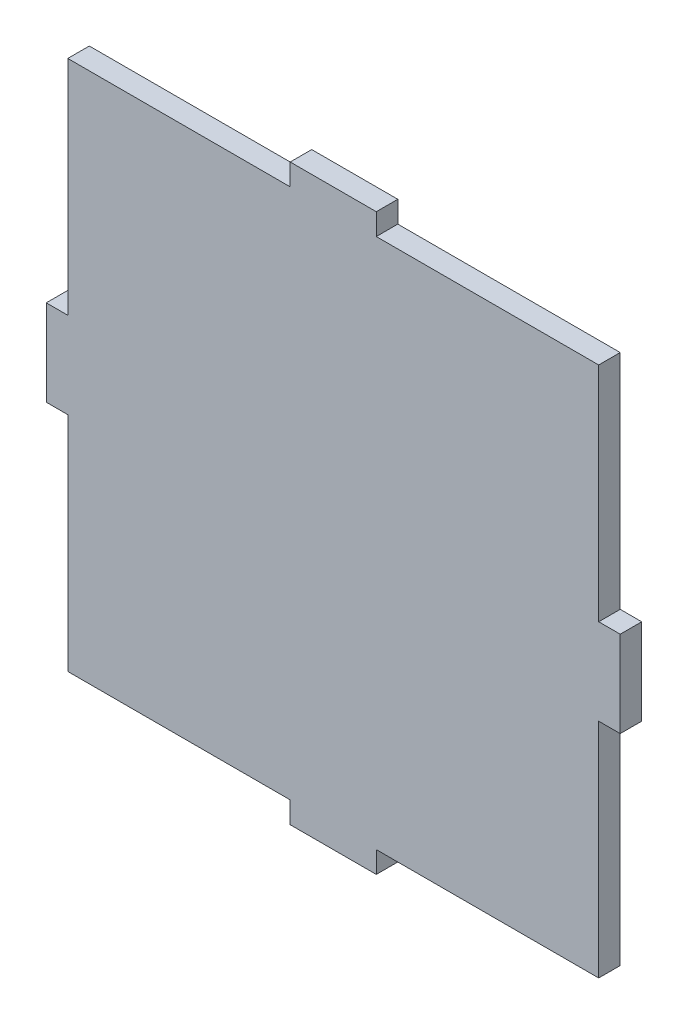
ISO-10303-21;
HEADER;
FILE_DESCRIPTION(('STEP AP214'),'2;1');
FILE_NAME('part.step','',(''),(''),'','','');
FILE_SCHEMA(('AUTOMOTIVE_DESIGN { 1 0 10303 214 1 1 1 1 }'));
ENDSEC;
DATA;
#1=APPLICATION_CONTEXT('core data for automotive mechanical design processes');
#2=APPLICATION_PROTOCOL_DEFINITION('international standard','automotive_design',2000,#1);
#3=PRODUCT_CONTEXT('',#1,'mechanical');
#4=PRODUCT('Part','Part','',(#3));
#5=PRODUCT_RELATED_PRODUCT_CATEGORY('part','',(#4));
#6=PRODUCT_DEFINITION_FORMATION('','',#4);
#7=PRODUCT_DEFINITION_CONTEXT('part definition',#1,'design');
#8=PRODUCT_DEFINITION('design','',#6,#7);
#9=PRODUCT_DEFINITION_SHAPE('','',#8);
#10=(LENGTH_UNIT() NAMED_UNIT(*) SI_UNIT(.MILLI.,.METRE.));
#11=(NAMED_UNIT(*) PLANE_ANGLE_UNIT() SI_UNIT($,.RADIAN.));
#12=(NAMED_UNIT(*) SI_UNIT($,.STERADIAN.) SOLID_ANGLE_UNIT());
#13=UNCERTAINTY_MEASURE_WITH_UNIT(LENGTH_MEASURE(1.E-05),#10,'distance_accuracy_value','');
#14=(GEOMETRIC_REPRESENTATION_CONTEXT(3) GLOBAL_UNCERTAINTY_ASSIGNED_CONTEXT((#13)) GLOBAL_UNIT_ASSIGNED_CONTEXT((#10,
#11,#12)) REPRESENTATION_CONTEXT('',''));
#15=CARTESIAN_POINT('',(0.,0.,0.));
#16=DIRECTION('',(0.,0.,1.));
#17=DIRECTION('',(1.,0.,0.));
#18=AXIS2_PLACEMENT_3D('',#15,#16,#17);
#19=CARTESIAN_POINT('',(-5.99999999999999,-40.,3.));
#20=DIRECTION('',(0.,1.,0.));
#21=DIRECTION('',(0.,0.,1.));
#22=AXIS2_PLACEMENT_3D('',#19,#20,#21);
#23=PLANE('',#22);
#24=DIRECTION('',(1.,0.,0.));
#25=VECTOR('',#24,1.);
#26=CARTESIAN_POINT('',(-5.99999999999999,-40.,0.));
#27=LINE('',#26,#25);
#28=CARTESIAN_POINT('',(-5.99999999999999,-40.,0.));
#29=VERTEX_POINT('',#28);
#30=CARTESIAN_POINT('',(5.99999999999999,-40.,0.));
#31=VERTEX_POINT('',#30);
#32=EDGE_CURVE('E201',#29,#31,#27,.T.);
#33=ORIENTED_EDGE('',*,*,#32,.T.);
#34=DIRECTION('',(0.,0.,-1.));
#35=VECTOR('',#34,1.);
#36=CARTESIAN_POINT('',(5.99999999999999,-40.,3.));
#37=LINE('',#36,#35);
#38=CARTESIAN_POINT('',(5.99999999999999,-40.,3.));
#39=VERTEX_POINT('',#38);
#40=EDGE_CURVE('E11',#39,#31,#37,.T.);
#41=ORIENTED_EDGE('',*,*,#40,.F.);
#42=DIRECTION('',(1.,0.,0.));
#43=VECTOR('',#42,1.);
#44=CARTESIAN_POINT('',(-5.99999999999999,-40.,3.));
#45=LINE('',#44,#43);
#46=CARTESIAN_POINT('',(-5.99999999999999,-40.,3.));
#47=VERTEX_POINT('',#46);
#48=EDGE_CURVE('E239',#47,#39,#45,.T.);
#49=ORIENTED_EDGE('',*,*,#48,.F.);
#50=DIRECTION('',(0.,0.,-1.));
#51=VECTOR('',#50,1.);
#52=CARTESIAN_POINT('',(-5.99999999999999,-40.,3.));
#53=LINE('',#52,#51);
#54=EDGE_CURVE('E197',#47,#29,#53,.T.);
#55=ORIENTED_EDGE('',*,*,#54,.T.);
#56=EDGE_LOOP('',(#33,#41,#49,#55));
#57=FACE_BOUND('',#56,.T.);
#58=ADVANCED_FACE('F33',(#57),#23,.F.);
#59=CARTESIAN_POINT('',(5.99999999999999,-40.,3.));
#60=DIRECTION('',(-1.,0.,0.));
#61=DIRECTION('',(0.,-1.,0.));
#62=AXIS2_PLACEMENT_3D('',#59,#60,#61);
#63=PLANE('',#62);
#64=DIRECTION('',(0.,1.,0.));
#65=VECTOR('',#64,1.);
#66=CARTESIAN_POINT('',(5.99999999999999,-40.,0.));
#67=LINE('',#66,#65);
#68=CARTESIAN_POINT('',(5.99999999999999,-37.,0.));
#69=VERTEX_POINT('',#68);
#70=EDGE_CURVE('E204',#31,#69,#67,.T.);
#71=ORIENTED_EDGE('',*,*,#70,.T.);
#72=DIRECTION('',(0.,0.,-1.));
#73=VECTOR('',#72,1.);
#74=CARTESIAN_POINT('',(5.99999999999999,-37.,3.));
#75=LINE('',#74,#73);
#76=CARTESIAN_POINT('',(5.99999999999999,-37.,3.));
#77=VERTEX_POINT('',#76);
#78=EDGE_CURVE('E41',#77,#69,#75,.T.);
#79=ORIENTED_EDGE('',*,*,#78,.F.);
#80=DIRECTION('',(0.,1.,0.));
#81=VECTOR('',#80,1.);
#82=CARTESIAN_POINT('',(5.99999999999999,-40.,3.));
#83=LINE('',#82,#81);
#84=EDGE_CURVE('E128',#39,#77,#83,.T.);
#85=ORIENTED_EDGE('',*,*,#84,.F.);
#86=ORIENTED_EDGE('',*,*,#40,.T.);
#87=EDGE_LOOP('',(#71,#79,#85,#86));
#88=FACE_BOUND('',#87,.T.);
#89=ADVANCED_FACE('F357',(#88),#63,.F.);
#90=CARTESIAN_POINT('',(5.99999999999999,-37.,3.));
#91=DIRECTION('',(0.,1.,0.));
#92=DIRECTION('',(0.,0.,1.));
#93=AXIS2_PLACEMENT_3D('',#90,#91,#92);
#94=PLANE('',#93);
#95=DIRECTION('',(1.,0.,0.));
#96=VECTOR('',#95,1.);
#97=CARTESIAN_POINT('',(5.99999999999999,-37.,0.));
#98=LINE('',#97,#96);
#99=CARTESIAN_POINT('',(37.,-37.,0.));
#100=VERTEX_POINT('',#99);
#101=EDGE_CURVE('E206',#69,#100,#98,.T.);
#102=ORIENTED_EDGE('',*,*,#101,.T.);
#103=DIRECTION('',(0.,0.,-1.));
#104=VECTOR('',#103,1.);
#105=CARTESIAN_POINT('',(37.,-37.,3.));
#106=LINE('',#105,#104);
#107=CARTESIAN_POINT('',(37.,-37.,3.));
#108=VERTEX_POINT('',#107);
#109=EDGE_CURVE('E282',#108,#100,#106,.T.);
#110=ORIENTED_EDGE('',*,*,#109,.F.);
#111=DIRECTION('',(1.,0.,0.));
#112=VECTOR('',#111,1.);
#113=CARTESIAN_POINT('',(5.99999999999999,-37.,3.));
#114=LINE('',#113,#112);
#115=EDGE_CURVE('E290',#77,#108,#114,.T.);
#116=ORIENTED_EDGE('',*,*,#115,.F.);
#117=ORIENTED_EDGE('',*,*,#78,.T.);
#118=EDGE_LOOP('',(#102,#110,#116,#117));
#119=FACE_BOUND('',#118,.T.);
#120=ADVANCED_FACE('F288',(#119),#94,.F.);
#121=CARTESIAN_POINT('',(37.,-37.,3.));
#122=DIRECTION('',(-1.,0.,0.));
#123=DIRECTION('',(0.,-1.,0.));
#124=AXIS2_PLACEMENT_3D('',#121,#122,#123);
#125=PLANE('',#124);
#126=DIRECTION('',(0.,1.,0.));
#127=VECTOR('',#126,1.);
#128=CARTESIAN_POINT('',(37.,-37.,0.));
#129=LINE('',#128,#127);
#130=CARTESIAN_POINT('',(37.,-6.,0.));
#131=VERTEX_POINT('',#130);
#132=EDGE_CURVE('E208',#100,#131,#129,.T.);
#133=ORIENTED_EDGE('',*,*,#132,.T.);
#134=DIRECTION('',(0.,0.,-1.));
#135=VECTOR('',#134,1.);
#136=CARTESIAN_POINT('',(37.,-6.,3.));
#137=LINE('',#136,#135);
#138=CARTESIAN_POINT('',(37.,-6.,3.));
#139=VERTEX_POINT('',#138);
#140=EDGE_CURVE('E279',#139,#131,#137,.T.);
#141=ORIENTED_EDGE('',*,*,#140,.F.);
#142=DIRECTION('',(0.,1.,0.));
#143=VECTOR('',#142,1.);
#144=CARTESIAN_POINT('',(37.,-37.,3.));
#145=LINE('',#144,#143);
#146=EDGE_CURVE('E308',#108,#139,#145,.T.);
#147=ORIENTED_EDGE('',*,*,#146,.F.);
#148=ORIENTED_EDGE('',*,*,#109,.T.);
#149=EDGE_LOOP('',(#133,#141,#147,#148));
#150=FACE_BOUND('',#149,.T.);
#151=ADVANCED_FACE('F299',(#150),#125,.F.);
#152=CARTESIAN_POINT('',(37.,-6.,3.));
#153=DIRECTION('',(0.,1.,0.));
#154=DIRECTION('',(-1.,0.,0.));
#155=AXIS2_PLACEMENT_3D('',#152,#153,#154);
#156=PLANE('',#155);
#157=DIRECTION('',(1.,0.,0.));
#158=VECTOR('',#157,1.);
#159=CARTESIAN_POINT('',(37.,-6.,0.));
#160=LINE('',#159,#158);
#161=CARTESIAN_POINT('',(40.,-6.,0.));
#162=VERTEX_POINT('',#161);
#163=EDGE_CURVE('E210',#131,#162,#160,.T.);
#164=ORIENTED_EDGE('',*,*,#163,.T.);
#165=DIRECTION('',(0.,0.,-1.));
#166=VECTOR('',#165,1.);
#167=CARTESIAN_POINT('',(40.,-6.,3.));
#168=LINE('',#167,#166);
#169=CARTESIAN_POINT('',(40.,-6.,3.));
#170=VERTEX_POINT('',#169);
#171=EDGE_CURVE('E276',#170,#162,#168,.T.);
#172=ORIENTED_EDGE('',*,*,#171,.F.);
#173=DIRECTION('',(1.,0.,0.));
#174=VECTOR('',#173,1.);
#175=CARTESIAN_POINT('',(37.,-6.,3.));
#176=LINE('',#175,#174);
#177=EDGE_CURVE('E305',#139,#170,#176,.T.);
#178=ORIENTED_EDGE('',*,*,#177,.F.);
#179=ORIENTED_EDGE('',*,*,#140,.T.);
#180=EDGE_LOOP('',(#164,#172,#178,#179));
#181=FACE_BOUND('',#180,.T.);
#182=ADVANCED_FACE('F303',(#181),#156,.F.);
#183=CARTESIAN_POINT('',(40.,-6.,3.));
#184=DIRECTION('',(-1.,0.,0.));
#185=DIRECTION('',(0.,0.,1.));
#186=AXIS2_PLACEMENT_3D('',#183,#184,#185);
#187=PLANE('',#186);
#188=DIRECTION('',(0.,1.,0.));
#189=VECTOR('',#188,1.);
#190=CARTESIAN_POINT('',(40.,-6.,0.));
#191=LINE('',#190,#189);
#192=CARTESIAN_POINT('',(40.,6.,0.));
#193=VERTEX_POINT('',#192);
#194=EDGE_CURVE('E212',#162,#193,#191,.T.);
#195=ORIENTED_EDGE('',*,*,#194,.T.);
#196=DIRECTION('',(0.,0.,-1.));
#197=VECTOR('',#196,1.);
#198=CARTESIAN_POINT('',(40.,6.,3.));
#199=LINE('',#198,#197);
#200=CARTESIAN_POINT('',(40.,6.,3.));
#201=VERTEX_POINT('',#200);
#202=EDGE_CURVE('E273',#201,#193,#199,.T.);
#203=ORIENTED_EDGE('',*,*,#202,.F.);
#204=DIRECTION('',(0.,1.,0.));
#205=VECTOR('',#204,1.);
#206=CARTESIAN_POINT('',(40.,-6.,3.));
#207=LINE('',#206,#205);
#208=EDGE_CURVE('E307',#170,#201,#207,.T.);
#209=ORIENTED_EDGE('',*,*,#208,.F.);
#210=ORIENTED_EDGE('',*,*,#171,.T.);
#211=EDGE_LOOP('',(#195,#203,#209,#210));
#212=FACE_BOUND('',#211,.T.);
#213=ADVANCED_FACE('F370',(#212),#187,.F.);
#214=CARTESIAN_POINT('',(37.,6.,3.));
#215=DIRECTION('',(0.,-1.,0.));
#216=DIRECTION('',(1.,0.,0.));
#217=AXIS2_PLACEMENT_3D('',#214,#215,#216);
#218=PLANE('',#217);
#219=DIRECTION('',(-1.,0.,0.));
#220=VECTOR('',#219,1.);
#221=CARTESIAN_POINT('',(37.,6.,0.));
#222=LINE('',#221,#220);
#223=CARTESIAN_POINT('',(37.,6.,0.));
#224=VERTEX_POINT('',#223);
#225=EDGE_CURVE('E214',#193,#224,#222,.T.);
#226=ORIENTED_EDGE('',*,*,#225,.T.);
#227=DIRECTION('',(0.,0.,-1.));
#228=VECTOR('',#227,1.);
#229=CARTESIAN_POINT('',(37.,6.,3.));
#230=LINE('',#229,#228);
#231=CARTESIAN_POINT('',(37.,6.,3.));
#232=VERTEX_POINT('',#231);
#233=EDGE_CURVE('E270',#232,#224,#230,.T.);
#234=ORIENTED_EDGE('',*,*,#233,.F.);
#235=DIRECTION('',(-1.,0.,0.));
#236=VECTOR('',#235,1.);
#237=CARTESIAN_POINT('',(37.,6.,3.));
#238=LINE('',#237,#236);
#239=EDGE_CURVE('E310',#201,#232,#238,.T.);
#240=ORIENTED_EDGE('',*,*,#239,.F.);
#241=ORIENTED_EDGE('',*,*,#202,.T.);
#242=EDGE_LOOP('',(#226,#234,#240,#241));
#243=FACE_BOUND('',#242,.T.);
#244=ADVANCED_FACE('F373',(#243),#218,.F.);
#245=CARTESIAN_POINT('',(37.,37.,3.));
#246=DIRECTION('',(-1.,0.,0.));
#247=DIRECTION('',(0.,-1.,0.));
#248=AXIS2_PLACEMENT_3D('',#245,#246,#247);
#249=PLANE('',#248);
#250=DIRECTION('',(0.,1.,0.));
#251=VECTOR('',#250,1.);
#252=CARTESIAN_POINT('',(37.,37.,0.));
#253=LINE('',#252,#251);
#254=CARTESIAN_POINT('',(37.,37.,0.));
#255=VERTEX_POINT('',#254);
#256=EDGE_CURVE('E216',#224,#255,#253,.T.);
#257=ORIENTED_EDGE('',*,*,#256,.T.);
#258=DIRECTION('',(0.,0.,-1.));
#259=VECTOR('',#258,1.);
#260=CARTESIAN_POINT('',(37.,37.,3.));
#261=LINE('',#260,#259);
#262=CARTESIAN_POINT('',(37.,37.,3.));
#263=VERTEX_POINT('',#262);
#264=EDGE_CURVE('E267',#263,#255,#261,.T.);
#265=ORIENTED_EDGE('',*,*,#264,.F.);
#266=DIRECTION('',(0.,1.,0.));
#267=VECTOR('',#266,1.);
#268=CARTESIAN_POINT('',(37.,37.,3.));
#269=LINE('',#268,#267);
#270=EDGE_CURVE('E316',#232,#263,#269,.T.);
#271=ORIENTED_EDGE('',*,*,#270,.F.);
#272=ORIENTED_EDGE('',*,*,#233,.T.);
#273=EDGE_LOOP('',(#257,#265,#271,#272));
#274=FACE_BOUND('',#273,.T.);
#275=ADVANCED_FACE('F377',(#274),#249,.F.);
#276=CARTESIAN_POINT('',(5.99999999999999,37.,3.));
#277=DIRECTION('',(0.,-1.,0.));
#278=DIRECTION('',(0.,0.,-1.));
#279=AXIS2_PLACEMENT_3D('',#276,#277,#278);
#280=PLANE('',#279);
#281=DIRECTION('',(-1.,0.,0.));
#282=VECTOR('',#281,1.);
#283=CARTESIAN_POINT('',(5.99999999999999,37.,0.));
#284=LINE('',#283,#282);
#285=CARTESIAN_POINT('',(5.99999999999999,37.,0.));
#286=VERTEX_POINT('',#285);
#287=EDGE_CURVE('E218',#255,#286,#284,.T.);
#288=ORIENTED_EDGE('',*,*,#287,.T.);
#289=DIRECTION('',(0.,0.,-1.));
#290=VECTOR('',#289,1.);
#291=CARTESIAN_POINT('',(5.99999999999999,37.,3.));
#292=LINE('',#291,#290);
#293=CARTESIAN_POINT('',(5.99999999999999,37.,3.));
#294=VERTEX_POINT('',#293);
#295=EDGE_CURVE('E264',#294,#286,#292,.T.);
#296=ORIENTED_EDGE('',*,*,#295,.F.);
#297=DIRECTION('',(-1.,0.,0.));
#298=VECTOR('',#297,1.);
#299=CARTESIAN_POINT('',(5.99999999999999,37.,3.));
#300=LINE('',#299,#298);
#301=EDGE_CURVE('E318',#263,#294,#300,.T.);
#302=ORIENTED_EDGE('',*,*,#301,.F.);
#303=ORIENTED_EDGE('',*,*,#264,.T.);
#304=EDGE_LOOP('',(#288,#296,#302,#303));
#305=FACE_BOUND('',#304,.T.);
#306=ADVANCED_FACE('F381',(#305),#280,.F.);
#307=CARTESIAN_POINT('',(5.99999999999999,40.,3.));
#308=DIRECTION('',(-1.,0.,0.));
#309=DIRECTION('',(0.,-1.,0.));
#310=AXIS2_PLACEMENT_3D('',#307,#308,#309);
#311=PLANE('',#310);
#312=DIRECTION('',(0.,1.,0.));
#313=VECTOR('',#312,1.);
#314=CARTESIAN_POINT('',(5.99999999999999,40.,0.));
#315=LINE('',#314,#313);
#316=CARTESIAN_POINT('',(5.99999999999999,40.,0.));
#317=VERTEX_POINT('',#316);
#318=EDGE_CURVE('E220',#286,#317,#315,.T.);
#319=ORIENTED_EDGE('',*,*,#318,.T.);
#320=DIRECTION('',(0.,0.,-1.));
#321=VECTOR('',#320,1.);
#322=CARTESIAN_POINT('',(5.99999999999999,40.,3.));
#323=LINE('',#322,#321);
#324=CARTESIAN_POINT('',(5.99999999999999,40.,3.));
#325=VERTEX_POINT('',#324);
#326=EDGE_CURVE('E261',#325,#317,#323,.T.);
#327=ORIENTED_EDGE('',*,*,#326,.F.);
#328=DIRECTION('',(0.,1.,0.));
#329=VECTOR('',#328,1.);
#330=CARTESIAN_POINT('',(5.99999999999999,40.,3.));
#331=LINE('',#330,#329);
#332=EDGE_CURVE('E320',#294,#325,#331,.T.);
#333=ORIENTED_EDGE('',*,*,#332,.F.);
#334=ORIENTED_EDGE('',*,*,#295,.T.);
#335=EDGE_LOOP('',(#319,#327,#333,#334));
#336=FACE_BOUND('',#335,.T.);
#337=ADVANCED_FACE('F385',(#336),#311,.F.);
#338=CARTESIAN_POINT('',(-5.99999999999999,40.,3.));
#339=DIRECTION('',(0.,-1.,0.));
#340=DIRECTION('',(0.,0.,-1.));
#341=AXIS2_PLACEMENT_3D('',#338,#339,#340);
#342=PLANE('',#341);
#343=DIRECTION('',(-1.,0.,0.));
#344=VECTOR('',#343,1.);
#345=CARTESIAN_POINT('',(-5.99999999999999,40.,0.));
#346=LINE('',#345,#344);
#347=CARTESIAN_POINT('',(-5.99999999999999,40.,0.));
#348=VERTEX_POINT('',#347);
#349=EDGE_CURVE('E222',#317,#348,#346,.T.);
#350=ORIENTED_EDGE('',*,*,#349,.T.);
#351=DIRECTION('',(0.,0.,-1.));
#352=VECTOR('',#351,1.);
#353=CARTESIAN_POINT('',(-5.99999999999999,40.,3.));
#354=LINE('',#353,#352);
#355=CARTESIAN_POINT('',(-5.99999999999999,40.,3.));
#356=VERTEX_POINT('',#355);
#357=EDGE_CURVE('E258',#356,#348,#354,.T.);
#358=ORIENTED_EDGE('',*,*,#357,.F.);
#359=DIRECTION('',(-1.,0.,0.));
#360=VECTOR('',#359,1.);
#361=CARTESIAN_POINT('',(-5.99999999999999,40.,3.));
#362=LINE('',#361,#360);
#363=EDGE_CURVE('E322',#325,#356,#362,.T.);
#364=ORIENTED_EDGE('',*,*,#363,.F.);
#365=ORIENTED_EDGE('',*,*,#326,.T.);
#366=EDGE_LOOP('',(#350,#358,#364,#365));
#367=FACE_BOUND('',#366,.T.);
#368=ADVANCED_FACE('F389',(#367),#342,.F.);
#369=CARTESIAN_POINT('',(-5.99999999999999,40.,3.));
#370=DIRECTION('',(1.,0.,0.));
#371=DIRECTION('',(0.,1.,0.));
#372=AXIS2_PLACEMENT_3D('',#369,#370,#371);
#373=PLANE('',#372);
#374=DIRECTION('',(0.,-1.,0.));
#375=VECTOR('',#374,1.);
#376=CARTESIAN_POINT('',(-5.99999999999999,40.,0.));
#377=LINE('',#376,#375);
#378=CARTESIAN_POINT('',(-5.99999999999999,37.,0.));
#379=VERTEX_POINT('',#378);
#380=EDGE_CURVE('E224',#348,#379,#377,.T.);
#381=ORIENTED_EDGE('',*,*,#380,.T.);
#382=DIRECTION('',(0.,0.,-1.));
#383=VECTOR('',#382,1.);
#384=CARTESIAN_POINT('',(-5.99999999999999,37.,3.));
#385=LINE('',#384,#383);
#386=CARTESIAN_POINT('',(-5.99999999999999,37.,3.));
#387=VERTEX_POINT('',#386);
#388=EDGE_CURVE('E255',#387,#379,#385,.T.);
#389=ORIENTED_EDGE('',*,*,#388,.F.);
#390=DIRECTION('',(0.,-1.,0.));
#391=VECTOR('',#390,1.);
#392=CARTESIAN_POINT('',(-5.99999999999999,40.,3.));
#393=LINE('',#392,#391);
#394=EDGE_CURVE('E324',#356,#387,#393,.T.);
#395=ORIENTED_EDGE('',*,*,#394,.F.);
#396=ORIENTED_EDGE('',*,*,#357,.T.);
#397=EDGE_LOOP('',(#381,#389,#395,#396));
#398=FACE_BOUND('',#397,.T.);
#399=ADVANCED_FACE('F393',(#398),#373,.F.);
#400=CARTESIAN_POINT('',(-5.99999999999999,37.,3.));
#401=DIRECTION('',(0.,-1.,0.));
#402=DIRECTION('',(0.,0.,-1.));
#403=AXIS2_PLACEMENT_3D('',#400,#401,#402);
#404=PLANE('',#403);
#405=DIRECTION('',(-1.,0.,0.));
#406=VECTOR('',#405,1.);
#407=CARTESIAN_POINT('',(-5.99999999999999,37.,0.));
#408=LINE('',#407,#406);
#409=CARTESIAN_POINT('',(-37.,37.,0.));
#410=VERTEX_POINT('',#409);
#411=EDGE_CURVE('E226',#379,#410,#408,.T.);
#412=ORIENTED_EDGE('',*,*,#411,.T.);
#413=DIRECTION('',(0.,0.,-1.));
#414=VECTOR('',#413,1.);
#415=CARTESIAN_POINT('',(-37.,37.,3.));
#416=LINE('',#415,#414);
#417=CARTESIAN_POINT('',(-37.,37.,3.));
#418=VERTEX_POINT('',#417);
#419=EDGE_CURVE('E252',#418,#410,#416,.T.);
#420=ORIENTED_EDGE('',*,*,#419,.F.);
#421=DIRECTION('',(-1.,0.,0.));
#422=VECTOR('',#421,1.);
#423=CARTESIAN_POINT('',(-5.99999999999999,37.,3.));
#424=LINE('',#423,#422);
#425=EDGE_CURVE('E326',#387,#418,#424,.T.);
#426=ORIENTED_EDGE('',*,*,#425,.F.);
#427=ORIENTED_EDGE('',*,*,#388,.T.);
#428=EDGE_LOOP('',(#412,#420,#426,#427));
#429=FACE_BOUND('',#428,.T.);
#430=ADVANCED_FACE('F397',(#429),#404,.F.);
#431=CARTESIAN_POINT('',(-37.,37.,3.));
#432=DIRECTION('',(1.,0.,0.));
#433=DIRECTION('',(0.,1.,0.));
#434=AXIS2_PLACEMENT_3D('',#431,#432,#433);
#435=PLANE('',#434);
#436=DIRECTION('',(0.,-1.,0.));
#437=VECTOR('',#436,1.);
#438=CARTESIAN_POINT('',(-37.,37.,0.));
#439=LINE('',#438,#437);
#440=CARTESIAN_POINT('',(-37.,6.,0.));
#441=VERTEX_POINT('',#440);
#442=EDGE_CURVE('E228',#410,#441,#439,.T.);
#443=ORIENTED_EDGE('',*,*,#442,.T.);
#444=DIRECTION('',(0.,0.,-1.));
#445=VECTOR('',#444,1.);
#446=CARTESIAN_POINT('',(-37.,6.,3.));
#447=LINE('',#446,#445);
#448=CARTESIAN_POINT('',(-37.,6.,3.));
#449=VERTEX_POINT('',#448);
#450=EDGE_CURVE('E249',#449,#441,#447,.T.);
#451=ORIENTED_EDGE('',*,*,#450,.F.);
#452=DIRECTION('',(0.,-1.,0.));
#453=VECTOR('',#452,1.);
#454=CARTESIAN_POINT('',(-37.,37.,3.));
#455=LINE('',#454,#453);
#456=EDGE_CURVE('E328',#418,#449,#455,.T.);
#457=ORIENTED_EDGE('',*,*,#456,.F.);
#458=ORIENTED_EDGE('',*,*,#419,.T.);
#459=EDGE_LOOP('',(#443,#451,#457,#458));
#460=FACE_BOUND('',#459,.T.);
#461=ADVANCED_FACE('F401',(#460),#435,.F.);
#462=CARTESIAN_POINT('',(-37.,6.,3.));
#463=DIRECTION('',(0.,-1.,0.));
#464=DIRECTION('',(1.,0.,0.));
#465=AXIS2_PLACEMENT_3D('',#462,#463,#464);
#466=PLANE('',#465);
#467=DIRECTION('',(-1.,0.,0.));
#468=VECTOR('',#467,1.);
#469=CARTESIAN_POINT('',(-37.,6.,0.));
#470=LINE('',#469,#468);
#471=CARTESIAN_POINT('',(-40.,6.,0.));
#472=VERTEX_POINT('',#471);
#473=EDGE_CURVE('E230',#441,#472,#470,.T.);
#474=ORIENTED_EDGE('',*,*,#473,.T.);
#475=DIRECTION('',(0.,0.,-1.));
#476=VECTOR('',#475,1.);
#477=CARTESIAN_POINT('',(-40.,6.,3.));
#478=LINE('',#477,#476);
#479=CARTESIAN_POINT('',(-40.,6.,3.));
#480=VERTEX_POINT('',#479);
#481=EDGE_CURVE('E246',#480,#472,#478,.T.);
#482=ORIENTED_EDGE('',*,*,#481,.F.);
#483=DIRECTION('',(-1.,0.,0.));
#484=VECTOR('',#483,1.);
#485=CARTESIAN_POINT('',(-37.,6.,3.));
#486=LINE('',#485,#484);
#487=EDGE_CURVE('E330',#449,#480,#486,.T.);
#488=ORIENTED_EDGE('',*,*,#487,.F.);
#489=ORIENTED_EDGE('',*,*,#450,.T.);
#490=EDGE_LOOP('',(#474,#482,#488,#489));
#491=FACE_BOUND('',#490,.T.);
#492=ADVANCED_FACE('F405',(#491),#466,.F.);
#493=CARTESIAN_POINT('',(-40.,-6.,3.));
#494=DIRECTION('',(1.,0.,0.));
#495=DIRECTION('',(0.,0.,-1.));
#496=AXIS2_PLACEMENT_3D('',#493,#494,#495);
#497=PLANE('',#496);
#498=DIRECTION('',(0.,-1.,0.));
#499=VECTOR('',#498,1.);
#500=CARTESIAN_POINT('',(-40.,-6.,0.));
#501=LINE('',#500,#499);
#502=CARTESIAN_POINT('',(-40.,-6.,0.));
#503=VERTEX_POINT('',#502);
#504=EDGE_CURVE('E232',#472,#503,#501,.T.);
#505=ORIENTED_EDGE('',*,*,#504,.T.);
#506=DIRECTION('',(0.,0.,-1.));
#507=VECTOR('',#506,1.);
#508=CARTESIAN_POINT('',(-40.,-6.,3.));
#509=LINE('',#508,#507);
#510=CARTESIAN_POINT('',(-40.,-6.,3.));
#511=VERTEX_POINT('',#510);
#512=EDGE_CURVE('E243',#511,#503,#509,.T.);
#513=ORIENTED_EDGE('',*,*,#512,.F.);
#514=DIRECTION('',(0.,-1.,0.));
#515=VECTOR('',#514,1.);
#516=CARTESIAN_POINT('',(-40.,-6.,3.));
#517=LINE('',#516,#515);
#518=EDGE_CURVE('E332',#480,#511,#517,.T.);
#519=ORIENTED_EDGE('',*,*,#518,.F.);
#520=ORIENTED_EDGE('',*,*,#481,.T.);
#521=EDGE_LOOP('',(#505,#513,#519,#520));
#522=FACE_BOUND('',#521,.T.);
#523=ADVANCED_FACE('F338',(#522),#497,.F.);
#524=CARTESIAN_POINT('',(-37.,-6.,3.));
#525=DIRECTION('',(0.,1.,0.));
#526=DIRECTION('',(-1.,0.,0.));
#527=AXIS2_PLACEMENT_3D('',#524,#525,#526);
#528=PLANE('',#527);
#529=DIRECTION('',(1.,0.,0.));
#530=VECTOR('',#529,1.);
#531=CARTESIAN_POINT('',(-37.,-6.,0.));
#532=LINE('',#531,#530);
#533=CARTESIAN_POINT('',(-37.,-6.,0.));
#534=VERTEX_POINT('',#533);
#535=EDGE_CURVE('E234',#503,#534,#532,.T.);
#536=ORIENTED_EDGE('',*,*,#535,.T.);
#537=DIRECTION('',(0.,0.,-1.));
#538=VECTOR('',#537,1.);
#539=CARTESIAN_POINT('',(-37.,-6.,3.));
#540=LINE('',#539,#538);
#541=CARTESIAN_POINT('',(-37.,-6.,3.));
#542=VERTEX_POINT('',#541);
#543=EDGE_CURVE('E192',#542,#534,#540,.T.);
#544=ORIENTED_EDGE('',*,*,#543,.F.);
#545=DIRECTION('',(1.,0.,0.));
#546=VECTOR('',#545,1.);
#547=CARTESIAN_POINT('',(-37.,-6.,3.));
#548=LINE('',#547,#546);
#549=EDGE_CURVE('E183',#511,#542,#548,.T.);
#550=ORIENTED_EDGE('',*,*,#549,.F.);
#551=ORIENTED_EDGE('',*,*,#512,.T.);
#552=EDGE_LOOP('',(#536,#544,#550,#551));
#553=FACE_BOUND('',#552,.T.);
#554=ADVANCED_FACE('F342',(#553),#528,.F.);
#555=CARTESIAN_POINT('',(-37.,-37.,3.));
#556=DIRECTION('',(1.,0.,0.));
#557=DIRECTION('',(0.,1.,0.));
#558=AXIS2_PLACEMENT_3D('',#555,#556,#557);
#559=PLANE('',#558);
#560=DIRECTION('',(0.,-1.,0.));
#561=VECTOR('',#560,1.);
#562=CARTESIAN_POINT('',(-37.,-37.,0.));
#563=LINE('',#562,#561);
#564=CARTESIAN_POINT('',(-37.,-37.,0.));
#565=VERTEX_POINT('',#564);
#566=EDGE_CURVE('E191',#534,#565,#563,.T.);
#567=ORIENTED_EDGE('',*,*,#566,.T.);
#568=DIRECTION('',(0.,0.,-1.));
#569=VECTOR('',#568,1.);
#570=CARTESIAN_POINT('',(-37.,-37.,3.));
#571=LINE('',#570,#569);
#572=CARTESIAN_POINT('',(-37.,-37.,3.));
#573=VERTEX_POINT('',#572);
#574=EDGE_CURVE('E188',#573,#565,#571,.T.);
#575=ORIENTED_EDGE('',*,*,#574,.F.);
#576=DIRECTION('',(0.,-1.,0.));
#577=VECTOR('',#576,1.);
#578=CARTESIAN_POINT('',(-37.,-37.,3.));
#579=LINE('',#578,#577);
#580=EDGE_CURVE('E177',#542,#573,#579,.T.);
#581=ORIENTED_EDGE('',*,*,#580,.F.);
#582=ORIENTED_EDGE('',*,*,#543,.T.);
#583=EDGE_LOOP('',(#567,#575,#581,#582));
#584=FACE_BOUND('',#583,.T.);
#585=ADVANCED_FACE('F189',(#584),#559,.F.);
#586=CARTESIAN_POINT('',(-5.99999999999999,-37.,3.));
#587=DIRECTION('',(0.,1.,0.));
#588=DIRECTION('',(0.,0.,1.));
#589=AXIS2_PLACEMENT_3D('',#586,#587,#588);
#590=PLANE('',#589);
#591=DIRECTION('',(1.,0.,0.));
#592=VECTOR('',#591,1.);
#593=CARTESIAN_POINT('',(-5.99999999999999,-37.,0.));
#594=LINE('',#593,#592);
#595=CARTESIAN_POINT('',(-5.99999999999999,-37.,0.));
#596=VERTEX_POINT('',#595);
#597=EDGE_CURVE('E114',#565,#596,#594,.T.);
#598=ORIENTED_EDGE('',*,*,#597,.T.);
#599=DIRECTION('',(0.,0.,-1.));
#600=VECTOR('',#599,1.);
#601=CARTESIAN_POINT('',(-5.99999999999999,-37.,3.));
#602=LINE('',#601,#600);
#603=CARTESIAN_POINT('',(-5.99999999999999,-37.,3.));
#604=VERTEX_POINT('',#603);
#605=EDGE_CURVE('E193',#604,#596,#602,.T.);
#606=ORIENTED_EDGE('',*,*,#605,.F.);
#607=DIRECTION('',(1.,0.,0.));
#608=VECTOR('',#607,1.);
#609=CARTESIAN_POINT('',(-5.99999999999999,-37.,3.));
#610=LINE('',#609,#608);
#611=EDGE_CURVE('E181',#573,#604,#610,.T.);
#612=ORIENTED_EDGE('',*,*,#611,.F.);
#613=ORIENTED_EDGE('',*,*,#574,.T.);
#614=EDGE_LOOP('',(#598,#606,#612,#613));
#615=FACE_BOUND('',#614,.T.);
#616=ADVANCED_FACE('F195',(#615),#590,.F.);
#617=CARTESIAN_POINT('',(-5.99999999999999,-40.,3.));
#618=DIRECTION('',(1.,0.,0.));
#619=DIRECTION('',(0.,1.,0.));
#620=AXIS2_PLACEMENT_3D('',#617,#618,#619);
#621=PLANE('',#620);
#622=DIRECTION('',(0.,-1.,0.));
#623=VECTOR('',#622,1.);
#624=CARTESIAN_POINT('',(-5.99999999999999,-40.,0.));
#625=LINE('',#624,#623);
#626=EDGE_CURVE('E120',#596,#29,#625,.T.);
#627=ORIENTED_EDGE('',*,*,#626,.T.);
#628=ORIENTED_EDGE('',*,*,#54,.F.);
#629=DIRECTION('',(0.,-1.,0.));
#630=VECTOR('',#629,1.);
#631=CARTESIAN_POINT('',(-5.99999999999999,-40.,3.));
#632=LINE('',#631,#630);
#633=EDGE_CURVE('E49',#604,#47,#632,.T.);
#634=ORIENTED_EDGE('',*,*,#633,.F.);
#635=ORIENTED_EDGE('',*,*,#605,.T.);
#636=EDGE_LOOP('',(#627,#628,#634,#635));
#637=FACE_BOUND('',#636,.T.);
#638=ADVANCED_FACE('F346',(#637),#621,.F.);
#639=CARTESIAN_POINT('',(0.,0.,3.));
#640=DIRECTION('',(0.,0.,1.));
#641=DIRECTION('',(1.,0.,0.));
#642=AXIS2_PLACEMENT_3D('',#639,#640,#641);
#643=PLANE('',#642);
#644=ORIENTED_EDGE('',*,*,#48,.T.);
#645=ORIENTED_EDGE('',*,*,#84,.T.);
#646=ORIENTED_EDGE('',*,*,#115,.T.);
#647=ORIENTED_EDGE('',*,*,#146,.T.);
#648=ORIENTED_EDGE('',*,*,#177,.T.);
#649=ORIENTED_EDGE('',*,*,#208,.T.);
#650=ORIENTED_EDGE('',*,*,#239,.T.);
#651=ORIENTED_EDGE('',*,*,#270,.T.);
#652=ORIENTED_EDGE('',*,*,#301,.T.);
#653=ORIENTED_EDGE('',*,*,#332,.T.);
#654=ORIENTED_EDGE('',*,*,#363,.T.);
#655=ORIENTED_EDGE('',*,*,#394,.T.);
#656=ORIENTED_EDGE('',*,*,#425,.T.);
#657=ORIENTED_EDGE('',*,*,#456,.T.);
#658=ORIENTED_EDGE('',*,*,#487,.T.);
#659=ORIENTED_EDGE('',*,*,#518,.T.);
#660=ORIENTED_EDGE('',*,*,#549,.T.);
#661=ORIENTED_EDGE('',*,*,#580,.T.);
#662=ORIENTED_EDGE('',*,*,#611,.T.);
#663=ORIENTED_EDGE('',*,*,#633,.T.);
#664=EDGE_LOOP('',(#644,#645,#646,#647,#648,#649,#650,#651,#652,#653,#654,#655,#656,#657,#658,
#659,#660,#661,#662,#663));
#665=FACE_BOUND('',#664,.T.);
#666=ADVANCED_FACE('F179',(#665),#643,.T.);
#667=CARTESIAN_POINT('',(0.,0.,0.));
#668=DIRECTION('',(0.,0.,1.));
#669=DIRECTION('',(1.,0.,0.));
#670=AXIS2_PLACEMENT_3D('',#667,#668,#669);
#671=PLANE('',#670);
#672=ORIENTED_EDGE('',*,*,#32,.F.);
#673=ORIENTED_EDGE('',*,*,#626,.F.);
#674=ORIENTED_EDGE('',*,*,#597,.F.);
#675=ORIENTED_EDGE('',*,*,#566,.F.);
#676=ORIENTED_EDGE('',*,*,#535,.F.);
#677=ORIENTED_EDGE('',*,*,#504,.F.);
#678=ORIENTED_EDGE('',*,*,#473,.F.);
#679=ORIENTED_EDGE('',*,*,#442,.F.);
#680=ORIENTED_EDGE('',*,*,#411,.F.);
#681=ORIENTED_EDGE('',*,*,#380,.F.);
#682=ORIENTED_EDGE('',*,*,#349,.F.);
#683=ORIENTED_EDGE('',*,*,#318,.F.);
#684=ORIENTED_EDGE('',*,*,#287,.F.);
#685=ORIENTED_EDGE('',*,*,#256,.F.);
#686=ORIENTED_EDGE('',*,*,#225,.F.);
#687=ORIENTED_EDGE('',*,*,#194,.F.);
#688=ORIENTED_EDGE('',*,*,#163,.F.);
#689=ORIENTED_EDGE('',*,*,#132,.F.);
#690=ORIENTED_EDGE('',*,*,#101,.F.);
#691=ORIENTED_EDGE('',*,*,#70,.F.);
#692=EDGE_LOOP('',(#672,#673,#674,#675,#676,#677,#678,#679,#680,#681,#682,#683,#684,#685,#686,
#687,#688,#689,#690,#691));
#693=FACE_BOUND('',#692,.T.);
#694=ADVANCED_FACE('F294',(#693),#671,.F.);
#695=CLOSED_SHELL('',(#58,#89,#120,#151,#182,#213,#244,#275,#306,#337,#368,#399,#430,#461,#492,
#523,#554,#585,#616,#638,#666,#694));
#696=MANIFOLD_SOLID_BREP('B2',#695);
#697=ADVANCED_BREP_SHAPE_REPRESENTATION('',(#18,#696),#14);
#698=SHAPE_DEFINITION_REPRESENTATION(#9,#697);
ENDSEC;
END-ISO-10303-21;
